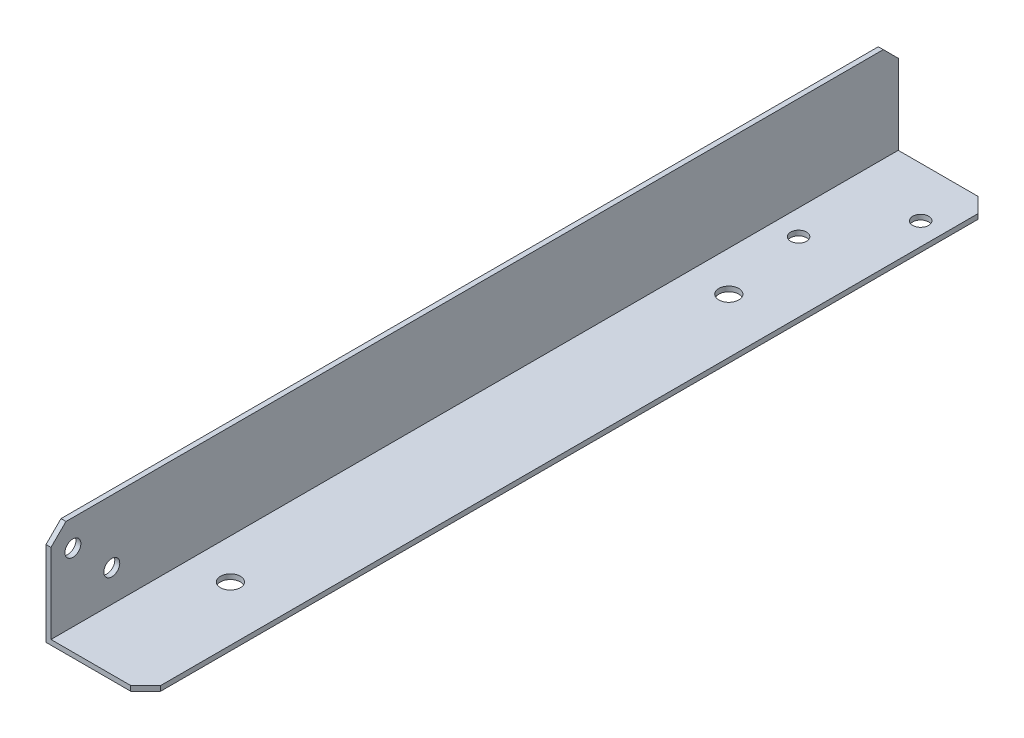
ISO-10303-21;
HEADER;
FILE_DESCRIPTION(('STEP AP214'),'2;1');
FILE_NAME('part.step','',(''),(''),'','','');
FILE_SCHEMA(('AUTOMOTIVE_DESIGN { 1 0 10303 214 1 1 1 1 }'));
ENDSEC;
DATA;
#1=APPLICATION_CONTEXT('core data for automotive mechanical design processes');
#2=APPLICATION_PROTOCOL_DEFINITION('international standard','automotive_design',2000,#1);
#3=PRODUCT_CONTEXT('',#1,'mechanical');
#4=PRODUCT('Part','Part','',(#3));
#5=PRODUCT_RELATED_PRODUCT_CATEGORY('part','',(#4));
#6=PRODUCT_DEFINITION_FORMATION('','',#4);
#7=PRODUCT_DEFINITION_CONTEXT('part definition',#1,'design');
#8=PRODUCT_DEFINITION('design','',#6,#7);
#9=PRODUCT_DEFINITION_SHAPE('','',#8);
#10=(LENGTH_UNIT() NAMED_UNIT(*) SI_UNIT(.MILLI.,.METRE.));
#11=(NAMED_UNIT(*) PLANE_ANGLE_UNIT() SI_UNIT($,.RADIAN.));
#12=(NAMED_UNIT(*) SI_UNIT($,.STERADIAN.) SOLID_ANGLE_UNIT());
#13=UNCERTAINTY_MEASURE_WITH_UNIT(LENGTH_MEASURE(1.E-05),#10,'distance_accuracy_value','');
#14=(GEOMETRIC_REPRESENTATION_CONTEXT(3) GLOBAL_UNCERTAINTY_ASSIGNED_CONTEXT((#13)) GLOBAL_UNIT_ASSIGNED_CONTEXT((#10,
#11,#12)) REPRESENTATION_CONTEXT('',''));
#15=CARTESIAN_POINT('',(0.,0.,0.));
#16=DIRECTION('',(0.,0.,1.));
#17=DIRECTION('',(1.,0.,0.));
#18=AXIS2_PLACEMENT_3D('',#15,#16,#17);
#19=CARTESIAN_POINT('',(0.,20.,170.));
#20=DIRECTION('',(1.,0.,0.));
#21=DIRECTION('',(0.,1.,0.));
#22=AXIS2_PLACEMENT_3D('',#19,#20,#21);
#23=PLANE('',#22);
#24=CARTESIAN_POINT('',(0.,14.68,165.6));
#25=DIRECTION('',(1.,0.,0.));
#26=DIRECTION('',(0.,0.,-1.));
#27=AXIS2_PLACEMENT_3D('',#24,#25,#26);
#28=CIRCLE('',#27,1.6);
#29=CARTESIAN_POINT('',(0.,14.68,164.));
#30=VERTEX_POINT('',#29);
#31=EDGE_CURVE('E222',#30,#30,#28,.T.);
#32=ORIENTED_EDGE('',*,*,#31,.T.);
#33=EDGE_LOOP('',(#32));
#34=FACE_BOUND('',#33,.T.);
#35=CARTESIAN_POINT('',(0.,7.38,157.8));
#36=DIRECTION('',(1.,0.,0.));
#37=DIRECTION('',(0.,0.,-1.));
#38=AXIS2_PLACEMENT_3D('',#35,#36,#37);
#39=CIRCLE('',#38,1.6);
#40=CARTESIAN_POINT('',(0.,7.38,156.2));
#41=VERTEX_POINT('',#40);
#42=EDGE_CURVE('E216',#41,#41,#39,.T.);
#43=ORIENTED_EDGE('',*,*,#42,.T.);
#44=EDGE_LOOP('',(#43));
#45=FACE_BOUND('',#44,.T.);
#46=DIRECTION('',(0.,-1.,0.));
#47=VECTOR('',#46,1.);
#48=CARTESIAN_POINT('',(0.,20.,170.));
#49=LINE('',#48,#47);
#50=CARTESIAN_POINT('',(0.,17.,170.));
#51=VERTEX_POINT('',#50);
#52=CARTESIAN_POINT('',(0.,0.,170.));
#53=VERTEX_POINT('',#52);
#54=EDGE_CURVE('E114',#51,#53,#49,.T.);
#55=ORIENTED_EDGE('',*,*,#54,.F.);
#56=DIRECTION('',(0.,0.707106781186546,-0.707106781186549));
#57=VECTOR('',#56,1.);
#58=CARTESIAN_POINT('',(0.,17.,170.));
#59=LINE('',#58,#57);
#60=CARTESIAN_POINT('',(0.,20.,167.));
#61=VERTEX_POINT('',#60);
#62=EDGE_CURVE('E163',#51,#61,#59,.T.);
#63=ORIENTED_EDGE('',*,*,#62,.T.);
#64=DIRECTION('',(0.,0.,-1.));
#65=VECTOR('',#64,1.);
#66=CARTESIAN_POINT('',(0.,20.,170.));
#67=LINE('',#66,#65);
#68=CARTESIAN_POINT('',(0.,20.,3.00000000000003));
#69=VERTEX_POINT('',#68);
#70=EDGE_CURVE('E195',#61,#69,#67,.T.);
#71=ORIENTED_EDGE('',*,*,#70,.T.);
#72=DIRECTION('',(0.,0.707106781186548,0.707106781186548));
#73=VECTOR('',#72,1.);
#74=CARTESIAN_POINT('',(0.,20.,3.00000000000003));
#75=LINE('',#74,#73);
#76=CARTESIAN_POINT('',(0.,17.,0.));
#77=VERTEX_POINT('',#76);
#78=EDGE_CURVE('E161',#69,#77,#75,.F.);
#79=ORIENTED_EDGE('',*,*,#78,.T.);
#80=DIRECTION('',(0.,-1.,0.));
#81=VECTOR('',#80,1.);
#82=CARTESIAN_POINT('',(0.,20.,0.));
#83=LINE('',#82,#81);
#84=CARTESIAN_POINT('',(0.,0.,0.));
#85=VERTEX_POINT('',#84);
#86=EDGE_CURVE('E137',#77,#85,#83,.T.);
#87=ORIENTED_EDGE('',*,*,#86,.T.);
#88=DIRECTION('',(0.,0.,-1.));
#89=VECTOR('',#88,1.);
#90=CARTESIAN_POINT('',(0.,0.,170.));
#91=LINE('',#90,#89);
#92=EDGE_CURVE('E132',#53,#85,#91,.T.);
#93=ORIENTED_EDGE('',*,*,#92,.F.);
#94=EDGE_LOOP('',(#55,#63,#71,#79,#87,#93));
#95=FACE_BOUND('',#94,.T.);
#96=ADVANCED_FACE('F35',(#34,#45,#95),#23,.F.);
#97=CARTESIAN_POINT('',(0.,0.,170.));
#98=DIRECTION('',(0.,1.,0.));
#99=DIRECTION('',(0.,0.,1.));
#100=AXIS2_PLACEMENT_3D('',#97,#98,#99);
#101=PLANE('',#100);
#102=CARTESIAN_POINT('',(15.5,0.,10.));
#103=DIRECTION('',(0.,1.,0.));
#104=DIRECTION('',(0.,0.,1.));
#105=AXIS2_PLACEMENT_3D('',#102,#103,#104);
#106=CIRCLE('',#105,1.59999999999999);
#107=CARTESIAN_POINT('',(15.5,0.,11.6));
#108=VERTEX_POINT('',#107);
#109=EDGE_CURVE('E234',#108,#108,#106,.T.);
#110=ORIENTED_EDGE('',*,*,#109,.T.);
#111=EDGE_LOOP('',(#110));
#112=FACE_BOUND('',#111,.T.);
#113=CARTESIAN_POINT('',(6.,0.,25.));
#114=DIRECTION('',(0.,1.,0.));
#115=DIRECTION('',(0.,0.,1.));
#116=AXIS2_PLACEMENT_3D('',#113,#114,#115);
#117=CIRCLE('',#116,1.59999999999999);
#118=CARTESIAN_POINT('',(6.,0.,26.6));
#119=VERTEX_POINT('',#118);
#120=EDGE_CURVE('E228',#119,#119,#117,.T.);
#121=ORIENTED_EDGE('',*,*,#120,.T.);
#122=EDGE_LOOP('',(#121));
#123=FACE_BOUND('',#122,.T.);
#124=CARTESIAN_POINT('',(9.,0.,42.));
#125=DIRECTION('',(0.,1.,0.));
#126=DIRECTION('',(0.,0.,1.));
#127=AXIS2_PLACEMENT_3D('',#124,#125,#126);
#128=CIRCLE('',#127,2.);
#129=CARTESIAN_POINT('',(9.,0.,44.));
#130=VERTEX_POINT('',#129);
#131=EDGE_CURVE('E210',#130,#130,#128,.T.);
#132=ORIENTED_EDGE('',*,*,#131,.T.);
#133=EDGE_LOOP('',(#132));
#134=FACE_BOUND('',#133,.T.);
#135=CARTESIAN_POINT('',(9.,0.,142.));
#136=DIRECTION('',(0.,1.,0.));
#137=DIRECTION('',(0.,0.,1.));
#138=AXIS2_PLACEMENT_3D('',#135,#136,#137);
#139=CIRCLE('',#138,2.);
#140=CARTESIAN_POINT('',(9.,0.,144.));
#141=VERTEX_POINT('',#140);
#142=EDGE_CURVE('E202',#141,#141,#139,.T.);
#143=ORIENTED_EDGE('',*,*,#142,.T.);
#144=EDGE_LOOP('',(#143));
#145=FACE_BOUND('',#144,.T.);
#146=DIRECTION('',(0.,0.,-1.));
#147=VECTOR('',#146,1.);
#148=CARTESIAN_POINT('',(20.,0.,170.));
#149=LINE('',#148,#147);
#150=CARTESIAN_POINT('',(20.,0.,167.));
#151=VERTEX_POINT('',#150);
#152=CARTESIAN_POINT('',(20.,0.,3.00000000000003));
#153=VERTEX_POINT('',#152);
#154=EDGE_CURVE('E139',#151,#153,#149,.T.);
#155=ORIENTED_EDGE('',*,*,#154,.F.);
#156=DIRECTION('',(-0.707106781186546,0.,0.707106781186549));
#157=VECTOR('',#156,1.);
#158=CARTESIAN_POINT('',(17.,0.,170.));
#159=LINE('',#158,#157);
#160=CARTESIAN_POINT('',(17.,0.,170.));
#161=VERTEX_POINT('',#160);
#162=EDGE_CURVE('E134',#151,#161,#159,.T.);
#163=ORIENTED_EDGE('',*,*,#162,.T.);
#164=DIRECTION('',(1.,0.,0.));
#165=VECTOR('',#164,1.);
#166=CARTESIAN_POINT('',(0.,0.,170.));
#167=LINE('',#166,#165);
#168=EDGE_CURVE('E118',#53,#161,#167,.T.);
#169=ORIENTED_EDGE('',*,*,#168,.F.);
#170=ORIENTED_EDGE('',*,*,#92,.T.);
#171=DIRECTION('',(1.,0.,0.));
#172=VECTOR('',#171,1.);
#173=CARTESIAN_POINT('',(0.,0.,0.));
#174=LINE('',#173,#172);
#175=CARTESIAN_POINT('',(17.,0.,0.));
#176=VERTEX_POINT('',#175);
#177=EDGE_CURVE('E175',#85,#176,#174,.T.);
#178=ORIENTED_EDGE('',*,*,#177,.T.);
#179=DIRECTION('',(-0.707106781186548,0.,-0.707106781186548));
#180=VECTOR('',#179,1.);
#181=CARTESIAN_POINT('',(20.,0.,3.00000000000003));
#182=LINE('',#181,#180);
#183=EDGE_CURVE('E158',#176,#153,#182,.F.);
#184=ORIENTED_EDGE('',*,*,#183,.T.);
#185=EDGE_LOOP('',(#155,#163,#169,#170,#178,#184));
#186=FACE_BOUND('',#185,.T.);
#187=ADVANCED_FACE('F130',(#112,#123,#134,#145,#186),#101,.F.);
#188=CARTESIAN_POINT('',(20.,0.,170.));
#189=DIRECTION('',(-1.,0.,0.));
#190=DIRECTION('',(0.,0.,1.));
#191=AXIS2_PLACEMENT_3D('',#188,#189,#190);
#192=PLANE('',#191);
#193=DIRECTION('',(0.,0.,-1.));
#194=VECTOR('',#193,1.);
#195=CARTESIAN_POINT('',(20.,1.,170.));
#196=LINE('',#195,#194);
#197=CARTESIAN_POINT('',(20.,1.,167.));
#198=VERTEX_POINT('',#197);
#199=CARTESIAN_POINT('',(20.,1.,3.00000000000003));
#200=VERTEX_POINT('',#199);
#201=EDGE_CURVE('E144',#198,#200,#196,.T.);
#202=ORIENTED_EDGE('',*,*,#201,.F.);
#203=DIRECTION('',(0.,-1.,0.));
#204=VECTOR('',#203,1.);
#205=CARTESIAN_POINT('',(20.,0.,167.));
#206=LINE('',#205,#204);
#207=EDGE_CURVE('E156',#198,#151,#206,.T.);
#208=ORIENTED_EDGE('',*,*,#207,.T.);
#209=ORIENTED_EDGE('',*,*,#154,.T.);
#210=DIRECTION('',(0.,1.,0.));
#211=VECTOR('',#210,1.);
#212=CARTESIAN_POINT('',(20.,0.,3.00000000000003));
#213=LINE('',#212,#211);
#214=EDGE_CURVE('E153',#153,#200,#213,.T.);
#215=ORIENTED_EDGE('',*,*,#214,.T.);
#216=EDGE_LOOP('',(#202,#208,#209,#215));
#217=FACE_BOUND('',#216,.T.);
#218=ADVANCED_FACE('F184',(#217),#192,.F.);
#219=CARTESIAN_POINT('',(20.,1.,170.));
#220=DIRECTION('',(0.,-1.,0.));
#221=DIRECTION('',(1.,0.,0.));
#222=AXIS2_PLACEMENT_3D('',#219,#220,#221);
#223=PLANE('',#222);
#224=CARTESIAN_POINT('',(15.5,1.,10.));
#225=DIRECTION('',(0.,1.,0.));
#226=DIRECTION('',(0.,0.,1.));
#227=AXIS2_PLACEMENT_3D('',#224,#225,#226);
#228=CIRCLE('',#227,1.59999999999999);
#229=CARTESIAN_POINT('',(15.5,1.,11.6));
#230=VERTEX_POINT('',#229);
#231=EDGE_CURVE('E237',#230,#230,#228,.T.);
#232=ORIENTED_EDGE('',*,*,#231,.F.);
#233=EDGE_LOOP('',(#232));
#234=FACE_BOUND('',#233,.T.);
#235=CARTESIAN_POINT('',(6.,0.999999999999999,25.));
#236=DIRECTION('',(0.,1.,0.));
#237=DIRECTION('',(0.,0.,1.));
#238=AXIS2_PLACEMENT_3D('',#235,#236,#237);
#239=CIRCLE('',#238,1.59999999999999);
#240=CARTESIAN_POINT('',(6.,0.999999999999999,26.6));
#241=VERTEX_POINT('',#240);
#242=EDGE_CURVE('E231',#241,#241,#239,.T.);
#243=ORIENTED_EDGE('',*,*,#242,.F.);
#244=EDGE_LOOP('',(#243));
#245=FACE_BOUND('',#244,.T.);
#246=CARTESIAN_POINT('',(9.,0.999999999999999,42.));
#247=DIRECTION('',(0.,1.,0.));
#248=DIRECTION('',(0.,0.,1.));
#249=AXIS2_PLACEMENT_3D('',#246,#247,#248);
#250=CIRCLE('',#249,2.);
#251=CARTESIAN_POINT('',(9.,0.999999999999999,44.));
#252=VERTEX_POINT('',#251);
#253=EDGE_CURVE('E213',#252,#252,#250,.T.);
#254=ORIENTED_EDGE('',*,*,#253,.F.);
#255=EDGE_LOOP('',(#254));
#256=FACE_BOUND('',#255,.T.);
#257=CARTESIAN_POINT('',(9.,0.999999999999999,142.));
#258=DIRECTION('',(0.,1.,0.));
#259=DIRECTION('',(0.,0.,1.));
#260=AXIS2_PLACEMENT_3D('',#257,#258,#259);
#261=CIRCLE('',#260,2.);
#262=CARTESIAN_POINT('',(9.,0.999999999999999,144.));
#263=VERTEX_POINT('',#262);
#264=EDGE_CURVE('E207',#263,#263,#261,.T.);
#265=ORIENTED_EDGE('',*,*,#264,.F.);
#266=EDGE_LOOP('',(#265));
#267=FACE_BOUND('',#266,.T.);
#268=DIRECTION('',(-1.,0.,0.));
#269=VECTOR('',#268,1.);
#270=CARTESIAN_POINT('',(20.,1.,170.));
#271=LINE('',#270,#269);
#272=CARTESIAN_POINT('',(17.,1.,170.));
#273=VERTEX_POINT('',#272);
#274=CARTESIAN_POINT('',(1.,0.999999999999998,170.));
#275=VERTEX_POINT('',#274);
#276=EDGE_CURVE('E135',#273,#275,#271,.T.);
#277=ORIENTED_EDGE('',*,*,#276,.F.);
#278=DIRECTION('',(0.707106781186546,0.,-0.707106781186549));
#279=VECTOR('',#278,1.);
#280=CARTESIAN_POINT('',(17.,1.,170.));
#281=LINE('',#280,#279);
#282=EDGE_CURVE('E151',#273,#198,#281,.T.);
#283=ORIENTED_EDGE('',*,*,#282,.T.);
#284=ORIENTED_EDGE('',*,*,#201,.T.);
#285=DIRECTION('',(0.707106781186548,0.,0.707106781186548));
#286=VECTOR('',#285,1.);
#287=CARTESIAN_POINT('',(20.,1.,3.00000000000003));
#288=LINE('',#287,#286);
#289=CARTESIAN_POINT('',(17.,1.,0.));
#290=VERTEX_POINT('',#289);
#291=EDGE_CURVE('E149',#200,#290,#288,.F.);
#292=ORIENTED_EDGE('',*,*,#291,.T.);
#293=DIRECTION('',(-1.,0.,0.));
#294=VECTOR('',#293,1.);
#295=CARTESIAN_POINT('',(20.,1.,0.));
#296=LINE('',#295,#294);
#297=CARTESIAN_POINT('',(1.,0.999999999999998,0.));
#298=VERTEX_POINT('',#297);
#299=EDGE_CURVE('E176',#290,#298,#296,.T.);
#300=ORIENTED_EDGE('',*,*,#299,.T.);
#301=DIRECTION('',(0.,0.,-1.));
#302=VECTOR('',#301,1.);
#303=CARTESIAN_POINT('',(1.,0.999999999999998,170.));
#304=LINE('',#303,#302);
#305=EDGE_CURVE('E189',#275,#298,#304,.T.);
#306=ORIENTED_EDGE('',*,*,#305,.F.);
#307=EDGE_LOOP('',(#277,#283,#284,#292,#300,#306));
#308=FACE_BOUND('',#307,.T.);
#309=ADVANCED_FACE('F188',(#234,#245,#256,#267,#308),#223,.F.);
#310=CARTESIAN_POINT('',(1.,0.999999999999998,170.));
#311=DIRECTION('',(-1.,0.,0.));
#312=DIRECTION('',(0.,-1.,0.));
#313=AXIS2_PLACEMENT_3D('',#310,#311,#312);
#314=PLANE('',#313);
#315=CARTESIAN_POINT('',(1.,14.68,165.6));
#316=DIRECTION('',(1.,0.,0.));
#317=DIRECTION('',(0.,0.,-1.));
#318=AXIS2_PLACEMENT_3D('',#315,#316,#317);
#319=CIRCLE('',#318,1.6);
#320=CARTESIAN_POINT('',(1.,14.68,164.));
#321=VERTEX_POINT('',#320);
#322=EDGE_CURVE('E225',#321,#321,#319,.T.);
#323=ORIENTED_EDGE('',*,*,#322,.F.);
#324=EDGE_LOOP('',(#323));
#325=FACE_BOUND('',#324,.T.);
#326=CARTESIAN_POINT('',(1.,7.38,157.8));
#327=DIRECTION('',(1.,0.,0.));
#328=DIRECTION('',(0.,0.,-1.));
#329=AXIS2_PLACEMENT_3D('',#326,#327,#328);
#330=CIRCLE('',#329,1.6);
#331=CARTESIAN_POINT('',(1.,7.38,156.2));
#332=VERTEX_POINT('',#331);
#333=EDGE_CURVE('E219',#332,#332,#330,.T.);
#334=ORIENTED_EDGE('',*,*,#333,.F.);
#335=EDGE_LOOP('',(#334));
#336=FACE_BOUND('',#335,.T.);
#337=DIRECTION('',(0.,0.,-1.));
#338=VECTOR('',#337,1.);
#339=CARTESIAN_POINT('',(1.,20.,170.));
#340=LINE('',#339,#338);
#341=CARTESIAN_POINT('',(1.,20.,167.));
#342=VERTEX_POINT('',#341);
#343=CARTESIAN_POINT('',(1.,20.,3.00000000000003));
#344=VERTEX_POINT('',#343);
#345=EDGE_CURVE('E191',#342,#344,#340,.T.);
#346=ORIENTED_EDGE('',*,*,#345,.F.);
#347=DIRECTION('',(0.,-0.707106781186546,0.707106781186549));
#348=VECTOR('',#347,1.);
#349=CARTESIAN_POINT('',(1.,17.,170.));
#350=LINE('',#349,#348);
#351=CARTESIAN_POINT('',(1.,17.,170.));
#352=VERTEX_POINT('',#351);
#353=EDGE_CURVE('E171',#342,#352,#350,.T.);
#354=ORIENTED_EDGE('',*,*,#353,.T.);
#355=DIRECTION('',(0.,1.,0.));
#356=VECTOR('',#355,1.);
#357=CARTESIAN_POINT('',(1.,0.999999999999998,170.));
#358=LINE('',#357,#356);
#359=EDGE_CURVE('E198',#275,#352,#358,.T.);
#360=ORIENTED_EDGE('',*,*,#359,.F.);
#361=ORIENTED_EDGE('',*,*,#305,.T.);
#362=DIRECTION('',(0.,1.,0.));
#363=VECTOR('',#362,1.);
#364=CARTESIAN_POINT('',(1.,0.999999999999998,0.));
#365=LINE('',#364,#363);
#366=CARTESIAN_POINT('',(1.,17.,0.));
#367=VERTEX_POINT('',#366);
#368=EDGE_CURVE('E125',#298,#367,#365,.T.);
#369=ORIENTED_EDGE('',*,*,#368,.T.);
#370=DIRECTION('',(0.,-0.707106781186548,-0.707106781186548));
#371=VECTOR('',#370,1.);
#372=CARTESIAN_POINT('',(1.,20.,3.00000000000003));
#373=LINE('',#372,#371);
#374=EDGE_CURVE('E55',#367,#344,#373,.F.);
#375=ORIENTED_EDGE('',*,*,#374,.T.);
#376=EDGE_LOOP('',(#346,#354,#360,#361,#369,#375));
#377=FACE_BOUND('',#376,.T.);
#378=ADVANCED_FACE('F245',(#325,#336,#377),#314,.F.);
#379=CARTESIAN_POINT('',(1.,20.,170.));
#380=DIRECTION('',(0.,-1.,0.));
#381=DIRECTION('',(0.,0.,-1.));
#382=AXIS2_PLACEMENT_3D('',#379,#380,#381);
#383=PLANE('',#382);
#384=ORIENTED_EDGE('',*,*,#70,.F.);
#385=DIRECTION('',(1.,0.,0.));
#386=VECTOR('',#385,1.);
#387=CARTESIAN_POINT('',(1.,20.,167.));
#388=LINE('',#387,#386);
#389=EDGE_CURVE('E168',#61,#342,#388,.T.);
#390=ORIENTED_EDGE('',*,*,#389,.T.);
#391=ORIENTED_EDGE('',*,*,#345,.T.);
#392=DIRECTION('',(-1.,0.,0.));
#393=VECTOR('',#392,1.);
#394=CARTESIAN_POINT('',(1.,20.,3.00000000000003));
#395=LINE('',#394,#393);
#396=EDGE_CURVE('E165',#344,#69,#395,.T.);
#397=ORIENTED_EDGE('',*,*,#396,.T.);
#398=EDGE_LOOP('',(#384,#390,#391,#397));
#399=FACE_BOUND('',#398,.T.);
#400=ADVANCED_FACE('F293',(#399),#383,.F.);
#401=CARTESIAN_POINT('',(0.,0.,170.));
#402=DIRECTION('',(0.,0.,1.));
#403=DIRECTION('',(1.,0.,0.));
#404=AXIS2_PLACEMENT_3D('',#401,#402,#403);
#405=PLANE('',#404);
#406=ORIENTED_EDGE('',*,*,#168,.T.);
#407=DIRECTION('',(0.,1.,0.));
#408=VECTOR('',#407,1.);
#409=CARTESIAN_POINT('',(17.,1.,170.));
#410=LINE('',#409,#408);
#411=EDGE_CURVE('E141',#161,#273,#410,.T.);
#412=ORIENTED_EDGE('',*,*,#411,.T.);
#413=ORIENTED_EDGE('',*,*,#276,.T.);
#414=ORIENTED_EDGE('',*,*,#359,.T.);
#415=DIRECTION('',(-1.,0.,0.));
#416=VECTOR('',#415,1.);
#417=CARTESIAN_POINT('',(0.,17.,170.));
#418=LINE('',#417,#416);
#419=EDGE_CURVE('E122',#352,#51,#418,.T.);
#420=ORIENTED_EDGE('',*,*,#419,.T.);
#421=ORIENTED_EDGE('',*,*,#54,.T.);
#422=EDGE_LOOP('',(#406,#412,#413,#414,#420,#421));
#423=FACE_BOUND('',#422,.T.);
#424=ADVANCED_FACE('F116',(#423),#405,.T.);
#425=CARTESIAN_POINT('',(0.,0.,0.));
#426=DIRECTION('',(0.,0.,1.));
#427=DIRECTION('',(1.,0.,0.));
#428=AXIS2_PLACEMENT_3D('',#425,#426,#427);
#429=PLANE('',#428);
#430=ORIENTED_EDGE('',*,*,#86,.F.);
#431=DIRECTION('',(1.,0.,0.));
#432=VECTOR('',#431,1.);
#433=CARTESIAN_POINT('',(0.,17.,0.));
#434=LINE('',#433,#432);
#435=EDGE_CURVE('E11',#77,#367,#434,.T.);
#436=ORIENTED_EDGE('',*,*,#435,.T.);
#437=ORIENTED_EDGE('',*,*,#368,.F.);
#438=ORIENTED_EDGE('',*,*,#299,.F.);
#439=DIRECTION('',(0.,-1.,0.));
#440=VECTOR('',#439,1.);
#441=CARTESIAN_POINT('',(17.,0.,0.));
#442=LINE('',#441,#440);
#443=EDGE_CURVE('E43',#290,#176,#442,.T.);
#444=ORIENTED_EDGE('',*,*,#443,.T.);
#445=ORIENTED_EDGE('',*,*,#177,.F.);
#446=EDGE_LOOP('',(#430,#436,#437,#438,#444,#445));
#447=FACE_BOUND('',#446,.T.);
#448=ADVANCED_FACE('F174',(#447),#429,.F.);
#449=CARTESIAN_POINT('',(17.,0.,170.));
#450=DIRECTION('',(0.707106781186549,0.,0.707106781186546));
#451=DIRECTION('',(0.,-1.,0.));
#452=AXIS2_PLACEMENT_3D('',#449,#450,#451);
#453=PLANE('',#452);
#454=ORIENTED_EDGE('',*,*,#162,.F.);
#455=ORIENTED_EDGE('',*,*,#207,.F.);
#456=ORIENTED_EDGE('',*,*,#282,.F.);
#457=ORIENTED_EDGE('',*,*,#411,.F.);
#458=EDGE_LOOP('',(#454,#455,#456,#457));
#459=FACE_BOUND('',#458,.T.);
#460=ADVANCED_FACE('F279',(#459),#453,.T.);
#461=CARTESIAN_POINT('',(0.,17.,170.));
#462=DIRECTION('',(0.,0.707106781186549,0.707106781186546));
#463=DIRECTION('',(1.,0.,0.));
#464=AXIS2_PLACEMENT_3D('',#461,#462,#463);
#465=PLANE('',#464);
#466=ORIENTED_EDGE('',*,*,#353,.F.);
#467=ORIENTED_EDGE('',*,*,#389,.F.);
#468=ORIENTED_EDGE('',*,*,#62,.F.);
#469=ORIENTED_EDGE('',*,*,#419,.F.);
#470=EDGE_LOOP('',(#466,#467,#468,#469));
#471=FACE_BOUND('',#470,.T.);
#472=ADVANCED_FACE('F282',(#471),#465,.T.);
#473=CARTESIAN_POINT('',(1.,20.,3.00000000000003));
#474=DIRECTION('',(0.,-0.707106781186547,0.707106781186547));
#475=DIRECTION('',(-1.,0.,0.));
#476=AXIS2_PLACEMENT_3D('',#473,#474,#475);
#477=PLANE('',#476);
#478=ORIENTED_EDGE('',*,*,#374,.F.);
#479=ORIENTED_EDGE('',*,*,#435,.F.);
#480=ORIENTED_EDGE('',*,*,#78,.F.);
#481=ORIENTED_EDGE('',*,*,#396,.F.);
#482=EDGE_LOOP('',(#478,#479,#480,#481));
#483=FACE_BOUND('',#482,.T.);
#484=ADVANCED_FACE('F265',(#483),#477,.F.);
#485=CARTESIAN_POINT('',(20.,0.,3.00000000000003));
#486=DIRECTION('',(-0.707106781186547,0.,0.707106781186547));
#487=DIRECTION('',(0.,1.,0.));
#488=AXIS2_PLACEMENT_3D('',#485,#486,#487);
#489=PLANE('',#488);
#490=ORIENTED_EDGE('',*,*,#183,.F.);
#491=ORIENTED_EDGE('',*,*,#443,.F.);
#492=ORIENTED_EDGE('',*,*,#291,.F.);
#493=ORIENTED_EDGE('',*,*,#214,.F.);
#494=EDGE_LOOP('',(#490,#491,#492,#493));
#495=FACE_BOUND('',#494,.T.);
#496=ADVANCED_FACE('F37',(#495),#489,.F.);
#497=CARTESIAN_POINT('',(9.,0.999999999999999,142.));
#498=DIRECTION('',(0.,1.,0.));
#499=DIRECTION('',(0.,0.,1.));
#500=AXIS2_PLACEMENT_3D('',#497,#498,#499);
#501=CYLINDRICAL_SURFACE('',#500,2.);
#502=ORIENTED_EDGE('',*,*,#142,.F.);
#503=EDGE_LOOP('',(#502));
#504=FACE_BOUND('',#503,.T.);
#505=ORIENTED_EDGE('',*,*,#264,.T.);
#506=EDGE_LOOP('',(#505));
#507=FACE_BOUND('',#506,.T.);
#508=ADVANCED_FACE('F253',(#504,#507),#501,.F.);
#509=CARTESIAN_POINT('',(9.,0.999999999999999,42.));
#510=DIRECTION('',(0.,1.,0.));
#511=DIRECTION('',(0.,0.,1.));
#512=AXIS2_PLACEMENT_3D('',#509,#510,#511);
#513=CYLINDRICAL_SURFACE('',#512,2.);
#514=ORIENTED_EDGE('',*,*,#131,.F.);
#515=EDGE_LOOP('',(#514));
#516=FACE_BOUND('',#515,.T.);
#517=ORIENTED_EDGE('',*,*,#253,.T.);
#518=EDGE_LOOP('',(#517));
#519=FACE_BOUND('',#518,.T.);
#520=ADVANCED_FACE('F255',(#516,#519),#513,.F.);
#521=CARTESIAN_POINT('',(1.,7.38,157.8));
#522=DIRECTION('',(1.,0.,0.));
#523=DIRECTION('',(0.,0.,-1.));
#524=AXIS2_PLACEMENT_3D('',#521,#522,#523);
#525=CYLINDRICAL_SURFACE('',#524,1.6);
#526=ORIENTED_EDGE('',*,*,#42,.F.);
#527=EDGE_LOOP('',(#526));
#528=FACE_BOUND('',#527,.T.);
#529=ORIENTED_EDGE('',*,*,#333,.T.);
#530=EDGE_LOOP('',(#529));
#531=FACE_BOUND('',#530,.T.);
#532=ADVANCED_FACE('F262',(#528,#531),#525,.F.);
#533=CARTESIAN_POINT('',(1.,14.68,165.6));
#534=DIRECTION('',(1.,0.,0.));
#535=DIRECTION('',(0.,0.,-1.));
#536=AXIS2_PLACEMENT_3D('',#533,#534,#535);
#537=CYLINDRICAL_SURFACE('',#536,1.6);
#538=ORIENTED_EDGE('',*,*,#31,.F.);
#539=EDGE_LOOP('',(#538));
#540=FACE_BOUND('',#539,.T.);
#541=ORIENTED_EDGE('',*,*,#322,.T.);
#542=EDGE_LOOP('',(#541));
#543=FACE_BOUND('',#542,.T.);
#544=ADVANCED_FACE('F332',(#540,#543),#537,.F.);
#545=CARTESIAN_POINT('',(6.,0.999999999999998,25.));
#546=DIRECTION('',(0.,1.,0.));
#547=DIRECTION('',(0.,0.,1.));
#548=AXIS2_PLACEMENT_3D('',#545,#546,#547);
#549=CYLINDRICAL_SURFACE('',#548,1.59999999999999);
#550=ORIENTED_EDGE('',*,*,#120,.F.);
#551=EDGE_LOOP('',(#550));
#552=FACE_BOUND('',#551,.T.);
#553=ORIENTED_EDGE('',*,*,#242,.T.);
#554=EDGE_LOOP('',(#553));
#555=FACE_BOUND('',#554,.T.);
#556=ADVANCED_FACE('F327',(#552,#555),#549,.F.);
#557=CARTESIAN_POINT('',(15.5,0.999999999999999,10.));
#558=DIRECTION('',(0.,1.,0.));
#559=DIRECTION('',(0.,0.,1.));
#560=AXIS2_PLACEMENT_3D('',#557,#558,#559);
#561=CYLINDRICAL_SURFACE('',#560,1.59999999999999);
#562=ORIENTED_EDGE('',*,*,#109,.F.);
#563=EDGE_LOOP('',(#562));
#564=FACE_BOUND('',#563,.T.);
#565=ORIENTED_EDGE('',*,*,#231,.T.);
#566=EDGE_LOOP('',(#565));
#567=FACE_BOUND('',#566,.T.);
#568=ADVANCED_FACE('F241',(#564,#567),#561,.F.);
#569=CLOSED_SHELL('',(#96,#187,#218,#309,#378,#400,#424,#448,#460,#472,#484,#496,#508,#520,#532,
#544,#556,#568));
#570=MANIFOLD_SOLID_BREP('B2',#569);
#571=ADVANCED_BREP_SHAPE_REPRESENTATION('',(#18,#570),#14);
#572=SHAPE_DEFINITION_REPRESENTATION(#9,#571);
ENDSEC;
END-ISO-10303-21;
